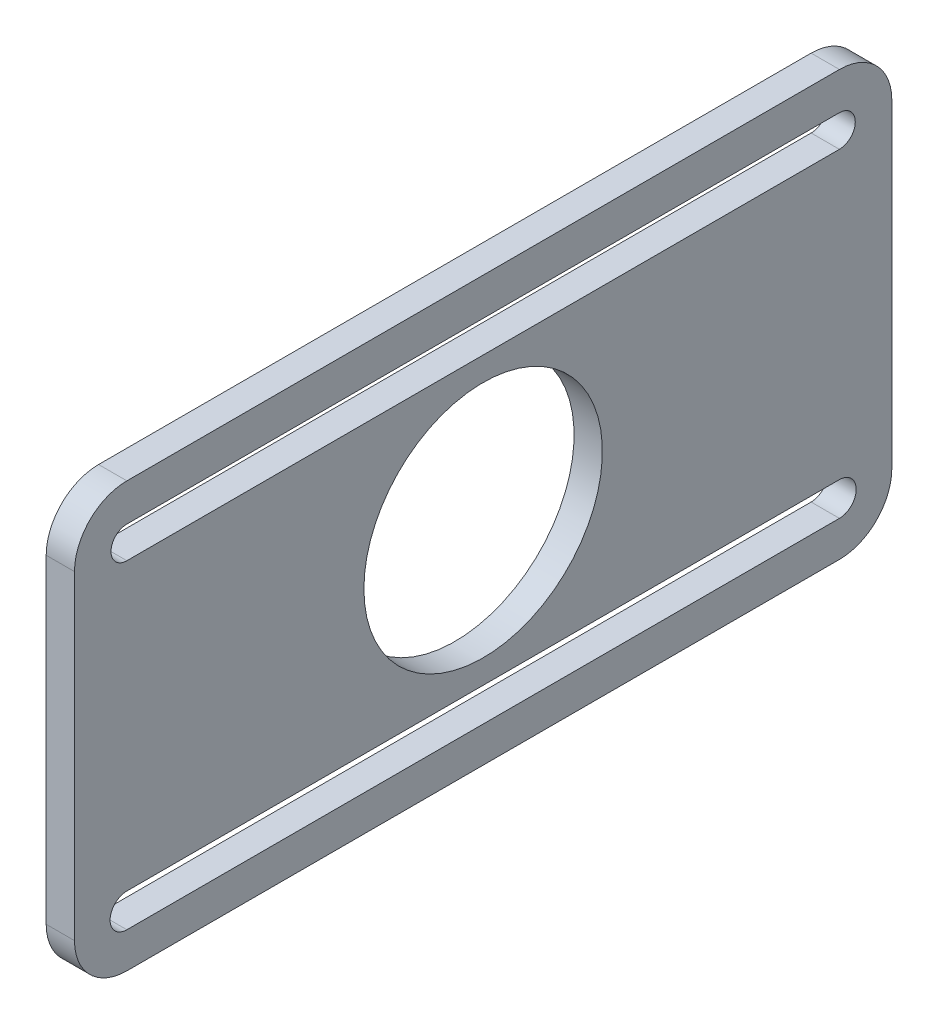
ISO-10303-21;
HEADER;
FILE_DESCRIPTION(('STEP AP214'),'2;1');
FILE_NAME('part.step','',(''),(''),'','','');
FILE_SCHEMA(('AUTOMOTIVE_DESIGN { 1 0 10303 214 1 1 1 1 }'));
ENDSEC;
DATA;
#1=APPLICATION_CONTEXT('core data for automotive mechanical design processes');
#2=APPLICATION_PROTOCOL_DEFINITION('international standard','automotive_design',2000,#1);
#3=PRODUCT_CONTEXT('',#1,'mechanical');
#4=PRODUCT('Part','Part','',(#3));
#5=PRODUCT_RELATED_PRODUCT_CATEGORY('part','',(#4));
#6=PRODUCT_DEFINITION_FORMATION('','',#4);
#7=PRODUCT_DEFINITION_CONTEXT('part definition',#1,'design');
#8=PRODUCT_DEFINITION('design','',#6,#7);
#9=PRODUCT_DEFINITION_SHAPE('','',#8);
#10=(LENGTH_UNIT() NAMED_UNIT(*) SI_UNIT(.MILLI.,.METRE.));
#11=(NAMED_UNIT(*) PLANE_ANGLE_UNIT() SI_UNIT($,.RADIAN.));
#12=(NAMED_UNIT(*) SI_UNIT($,.STERADIAN.) SOLID_ANGLE_UNIT());
#13=UNCERTAINTY_MEASURE_WITH_UNIT(LENGTH_MEASURE(1.E-05),#10,'distance_accuracy_value','');
#14=(GEOMETRIC_REPRESENTATION_CONTEXT(3) GLOBAL_UNCERTAINTY_ASSIGNED_CONTEXT((#13)) GLOBAL_UNIT_ASSIGNED_CONTEXT((#10,
#11,#12)) REPRESENTATION_CONTEXT('',''));
#15=CARTESIAN_POINT('',(0.,0.,0.));
#16=DIRECTION('',(0.,0.,1.));
#17=DIRECTION('',(1.,0.,0.));
#18=AXIS2_PLACEMENT_3D('',#15,#16,#17);
#19=CARTESIAN_POINT('',(2.7,-5.00509363152669,0.));
#20=DIRECTION('',(0.,-1.,0.));
#21=DIRECTION('',(0.,0.,-1.));
#22=AXIS2_PLACEMENT_3D('',#19,#20,#21);
#23=PLANE('',#22);
#24=DIRECTION('',(0.,0.,1.));
#25=VECTOR('',#24,1.);
#26=CARTESIAN_POINT('',(0.,-5.00509363152669,0.));
#27=LINE('',#26,#25);
#28=CARTESIAN_POINT('',(0.,-5.00509363152669,-34.));
#29=VERTEX_POINT('',#28);
#30=CARTESIAN_POINT('',(0.,-5.00509363152669,34.));
#31=VERTEX_POINT('',#30);
#32=EDGE_CURVE('E280',#29,#31,#27,.T.);
#33=ORIENTED_EDGE('',*,*,#32,.F.);
#34=DIRECTION('',(-1.,0.,0.));
#35=VECTOR('',#34,1.);
#36=CARTESIAN_POINT('',(2.7,-5.00509363152669,-34.));
#37=LINE('',#36,#35);
#38=CARTESIAN_POINT('',(2.7,-5.00509363152669,-34.));
#39=VERTEX_POINT('',#38);
#40=EDGE_CURVE('E11',#39,#29,#37,.T.);
#41=ORIENTED_EDGE('',*,*,#40,.F.);
#42=DIRECTION('',(0.,0.,1.));
#43=VECTOR('',#42,1.);
#44=CARTESIAN_POINT('',(2.7,-5.00509363152669,0.));
#45=LINE('',#44,#43);
#46=CARTESIAN_POINT('',(2.7,-5.00509363152669,34.));
#47=VERTEX_POINT('',#46);
#48=EDGE_CURVE('E343',#39,#47,#45,.T.);
#49=ORIENTED_EDGE('',*,*,#48,.T.);
#50=DIRECTION('',(-1.,0.,0.));
#51=VECTOR('',#50,1.);
#52=CARTESIAN_POINT('',(2.7,-5.00509363152669,34.));
#53=LINE('',#52,#51);
#54=EDGE_CURVE('E67',#47,#31,#53,.T.);
#55=ORIENTED_EDGE('',*,*,#54,.T.);
#56=EDGE_LOOP('',(#33,#41,#49,#55));
#57=FACE_BOUND('',#56,.T.);
#58=ADVANCED_FACE('F47',(#57),#23,.T.);
#59=CARTESIAN_POINT('',(2.7,-0.00509363152669193,-34.));
#60=DIRECTION('',(-1.,0.,0.));
#61=DIRECTION('',(0.,0.,1.));
#62=AXIS2_PLACEMENT_3D('',#59,#60,#61);
#63=CYLINDRICAL_SURFACE('',#62,5.);
#64=CARTESIAN_POINT('',(0.,-0.00509363152669193,-34.));
#65=DIRECTION('',(1.,0.,0.));
#66=DIRECTION('',(0.,0.,-1.));
#67=AXIS2_PLACEMENT_3D('',#64,#65,#66);
#68=CIRCLE('',#67,5.);
#69=CARTESIAN_POINT('',(0.,-0.00509363152669254,-39.));
#70=VERTEX_POINT('',#69);
#71=EDGE_CURVE('E283',#29,#70,#68,.T.);
#72=ORIENTED_EDGE('',*,*,#71,.T.);
#73=DIRECTION('',(-1.,0.,0.));
#74=VECTOR('',#73,1.);
#75=CARTESIAN_POINT('',(2.7,-0.00509363152669254,-39.));
#76=LINE('',#75,#74);
#77=CARTESIAN_POINT('',(2.7,-0.00509363152669254,-39.));
#78=VERTEX_POINT('',#77);
#79=EDGE_CURVE('E58',#78,#70,#76,.T.);
#80=ORIENTED_EDGE('',*,*,#79,.F.);
#81=CARTESIAN_POINT('',(2.7,-0.00509363152669193,-34.));
#82=DIRECTION('',(1.,0.,0.));
#83=DIRECTION('',(0.,0.,-1.));
#84=AXIS2_PLACEMENT_3D('',#81,#82,#83);
#85=CIRCLE('',#84,5.);
#86=EDGE_CURVE('E346',#39,#78,#85,.T.);
#87=ORIENTED_EDGE('',*,*,#86,.F.);
#88=ORIENTED_EDGE('',*,*,#40,.T.);
#89=EDGE_LOOP('',(#72,#80,#87,#88));
#90=FACE_BOUND('',#89,.T.);
#91=ADVANCED_FACE('F365',(#90),#63,.T.);
#92=CARTESIAN_POINT('',(2.7,0.,-39.));
#93=DIRECTION('',(0.,0.,-1.));
#94=DIRECTION('',(0.,1.,0.));
#95=AXIS2_PLACEMENT_3D('',#92,#93,#94);
#96=PLANE('',#95);
#97=DIRECTION('',(0.,-1.,0.));
#98=VECTOR('',#97,1.);
#99=CARTESIAN_POINT('',(0.,0.,-39.));
#100=LINE('',#99,#98);
#101=CARTESIAN_POINT('',(0.,30.4949063684733,-39.));
#102=VERTEX_POINT('',#101);
#103=EDGE_CURVE('E287',#102,#70,#100,.T.);
#104=ORIENTED_EDGE('',*,*,#103,.F.);
#105=DIRECTION('',(-1.,0.,0.));
#106=VECTOR('',#105,1.);
#107=CARTESIAN_POINT('',(2.7,30.4949063684733,-39.));
#108=LINE('',#107,#106);
#109=CARTESIAN_POINT('',(2.7,30.4949063684733,-39.));
#110=VERTEX_POINT('',#109);
#111=EDGE_CURVE('E206',#110,#102,#108,.T.);
#112=ORIENTED_EDGE('',*,*,#111,.F.);
#113=DIRECTION('',(0.,-1.,0.));
#114=VECTOR('',#113,1.);
#115=CARTESIAN_POINT('',(2.7,0.,-39.));
#116=LINE('',#115,#114);
#117=EDGE_CURVE('E349',#110,#78,#116,.T.);
#118=ORIENTED_EDGE('',*,*,#117,.T.);
#119=ORIENTED_EDGE('',*,*,#79,.T.);
#120=EDGE_LOOP('',(#104,#112,#118,#119));
#121=FACE_BOUND('',#120,.T.);
#122=ADVANCED_FACE('F368',(#121),#96,.T.);
#123=CARTESIAN_POINT('',(2.7,30.4949063684733,-34.));
#124=DIRECTION('',(-1.,0.,0.));
#125=DIRECTION('',(0.,0.,1.));
#126=AXIS2_PLACEMENT_3D('',#123,#124,#125);
#127=CYLINDRICAL_SURFACE('',#126,5.);
#128=CARTESIAN_POINT('',(0.,30.4949063684733,-34.));
#129=DIRECTION('',(1.,0.,0.));
#130=DIRECTION('',(0.,0.,-1.));
#131=AXIS2_PLACEMENT_3D('',#128,#129,#130);
#132=CIRCLE('',#131,5.);
#133=CARTESIAN_POINT('',(0.,35.4949063684733,-34.));
#134=VERTEX_POINT('',#133);
#135=EDGE_CURVE('E291',#134,#102,#132,.F.);
#136=ORIENTED_EDGE('',*,*,#135,.F.);
#137=DIRECTION('',(-1.,0.,0.));
#138=VECTOR('',#137,1.);
#139=CARTESIAN_POINT('',(2.7,35.4949063684733,-34.));
#140=LINE('',#139,#138);
#141=CARTESIAN_POINT('',(2.7,35.4949063684733,-34.));
#142=VERTEX_POINT('',#141);
#143=EDGE_CURVE('E199',#142,#134,#140,.T.);
#144=ORIENTED_EDGE('',*,*,#143,.F.);
#145=CARTESIAN_POINT('',(2.7,30.4949063684733,-34.));
#146=DIRECTION('',(1.,0.,0.));
#147=DIRECTION('',(0.,0.,-1.));
#148=AXIS2_PLACEMENT_3D('',#145,#146,#147);
#149=CIRCLE('',#148,5.);
#150=EDGE_CURVE('E353',#142,#110,#149,.F.);
#151=ORIENTED_EDGE('',*,*,#150,.T.);
#152=ORIENTED_EDGE('',*,*,#111,.T.);
#153=EDGE_LOOP('',(#136,#144,#151,#152));
#154=FACE_BOUND('',#153,.T.);
#155=ADVANCED_FACE('F371',(#154),#127,.T.);
#156=CARTESIAN_POINT('',(2.7,35.4949063684733,0.));
#157=DIRECTION('',(0.,-1.,0.));
#158=DIRECTION('',(0.,0.,-1.));
#159=AXIS2_PLACEMENT_3D('',#156,#157,#158);
#160=PLANE('',#159);
#161=DIRECTION('',(0.,0.,1.));
#162=VECTOR('',#161,1.);
#163=CARTESIAN_POINT('',(0.,35.4949063684733,0.));
#164=LINE('',#163,#162);
#165=CARTESIAN_POINT('',(0.,35.4949063684733,34.));
#166=VERTEX_POINT('',#165);
#167=EDGE_CURVE('E295',#134,#166,#164,.T.);
#168=ORIENTED_EDGE('',*,*,#167,.T.);
#169=DIRECTION('',(-1.,0.,0.));
#170=VECTOR('',#169,1.);
#171=CARTESIAN_POINT('',(2.7,35.4949063684733,34.));
#172=LINE('',#171,#170);
#173=CARTESIAN_POINT('',(2.7,35.4949063684733,34.));
#174=VERTEX_POINT('',#173);
#175=EDGE_CURVE('E195',#174,#166,#172,.T.);
#176=ORIENTED_EDGE('',*,*,#175,.F.);
#177=DIRECTION('',(0.,0.,1.));
#178=VECTOR('',#177,1.);
#179=CARTESIAN_POINT('',(2.7,35.4949063684733,0.));
#180=LINE('',#179,#178);
#181=EDGE_CURVE('E186',#142,#174,#180,.T.);
#182=ORIENTED_EDGE('',*,*,#181,.F.);
#183=ORIENTED_EDGE('',*,*,#143,.T.);
#184=EDGE_LOOP('',(#168,#176,#182,#183));
#185=FACE_BOUND('',#184,.T.);
#186=ADVANCED_FACE('F374',(#185),#160,.F.);
#187=CARTESIAN_POINT('',(2.7,30.4949063684733,34.));
#188=DIRECTION('',(-1.,0.,0.));
#189=DIRECTION('',(0.,0.,1.));
#190=AXIS2_PLACEMENT_3D('',#187,#188,#189);
#191=CYLINDRICAL_SURFACE('',#190,5.);
#192=CARTESIAN_POINT('',(0.,30.4949063684733,34.));
#193=DIRECTION('',(1.,0.,0.));
#194=DIRECTION('',(0.,0.,-1.));
#195=AXIS2_PLACEMENT_3D('',#192,#193,#194);
#196=CIRCLE('',#195,5.);
#197=CARTESIAN_POINT('',(0.,30.4949063684733,39.));
#198=VERTEX_POINT('',#197);
#199=EDGE_CURVE('E193',#166,#198,#196,.T.);
#200=ORIENTED_EDGE('',*,*,#199,.T.);
#201=DIRECTION('',(-1.,0.,0.));
#202=VECTOR('',#201,1.);
#203=CARTESIAN_POINT('',(2.7,30.4949063684733,39.));
#204=LINE('',#203,#202);
#205=CARTESIAN_POINT('',(2.7,30.4949063684733,39.));
#206=VERTEX_POINT('',#205);
#207=EDGE_CURVE('E173',#206,#198,#204,.T.);
#208=ORIENTED_EDGE('',*,*,#207,.F.);
#209=CARTESIAN_POINT('',(2.7,30.4949063684733,34.));
#210=DIRECTION('',(1.,0.,0.));
#211=DIRECTION('',(0.,0.,-1.));
#212=AXIS2_PLACEMENT_3D('',#209,#210,#211);
#213=CIRCLE('',#212,5.);
#214=EDGE_CURVE('E179',#174,#206,#213,.T.);
#215=ORIENTED_EDGE('',*,*,#214,.F.);
#216=ORIENTED_EDGE('',*,*,#175,.T.);
#217=EDGE_LOOP('',(#200,#208,#215,#216));
#218=FACE_BOUND('',#217,.T.);
#219=ADVANCED_FACE('F192',(#218),#191,.T.);
#220=CARTESIAN_POINT('',(2.7,0.,39.));
#221=DIRECTION('',(0.,0.,-1.));
#222=DIRECTION('',(0.,1.,0.));
#223=AXIS2_PLACEMENT_3D('',#220,#221,#222);
#224=PLANE('',#223);
#225=DIRECTION('',(0.,-1.,0.));
#226=VECTOR('',#225,1.);
#227=CARTESIAN_POINT('',(0.,0.,39.));
#228=LINE('',#227,#226);
#229=CARTESIAN_POINT('',(0.,-0.00509363152669254,39.));
#230=VERTEX_POINT('',#229);
#231=EDGE_CURVE('E301',#198,#230,#228,.T.);
#232=ORIENTED_EDGE('',*,*,#231,.T.);
#233=DIRECTION('',(-1.,0.,0.));
#234=VECTOR('',#233,1.);
#235=CARTESIAN_POINT('',(2.7,-0.00509363152669254,39.));
#236=LINE('',#235,#234);
#237=CARTESIAN_POINT('',(2.7,-0.00509363152669254,39.));
#238=VERTEX_POINT('',#237);
#239=EDGE_CURVE('E117',#238,#230,#236,.T.);
#240=ORIENTED_EDGE('',*,*,#239,.F.);
#241=DIRECTION('',(0.,-1.,0.));
#242=VECTOR('',#241,1.);
#243=CARTESIAN_POINT('',(2.7,0.,39.));
#244=LINE('',#243,#242);
#245=EDGE_CURVE('E169',#206,#238,#244,.T.);
#246=ORIENTED_EDGE('',*,*,#245,.F.);
#247=ORIENTED_EDGE('',*,*,#207,.T.);
#248=EDGE_LOOP('',(#232,#240,#246,#247));
#249=FACE_BOUND('',#248,.T.);
#250=ADVANCED_FACE('F171',(#249),#224,.F.);
#251=CARTESIAN_POINT('',(2.7,31.9222769607914,0.));
#252=DIRECTION('',(0.,1.,0.));
#253=DIRECTION('',(0.,0.,1.));
#254=AXIS2_PLACEMENT_3D('',#251,#252,#253);
#255=PLANE('',#254);
#256=DIRECTION('',(0.,0.,-1.));
#257=VECTOR('',#256,1.);
#258=CARTESIAN_POINT('',(0.,31.9222769607914,0.));
#259=LINE('',#258,#257);
#260=CARTESIAN_POINT('',(0.,31.9222769607914,34.));
#261=VERTEX_POINT('',#260);
#262=CARTESIAN_POINT('',(0.,31.9222769607914,-34.));
#263=VERTEX_POINT('',#262);
#264=EDGE_CURVE('E260',#261,#263,#259,.T.);
#265=ORIENTED_EDGE('',*,*,#264,.T.);
#266=DIRECTION('',(-1.,0.,0.));
#267=VECTOR('',#266,1.);
#268=CARTESIAN_POINT('',(2.7,31.9222769607914,-34.));
#269=LINE('',#268,#267);
#270=CARTESIAN_POINT('',(2.7,31.9222769607914,-34.));
#271=VERTEX_POINT('',#270);
#272=EDGE_CURVE('E220',#271,#263,#269,.T.);
#273=ORIENTED_EDGE('',*,*,#272,.F.);
#274=DIRECTION('',(0.,0.,-1.));
#275=VECTOR('',#274,1.);
#276=CARTESIAN_POINT('',(2.7,31.9222769607914,0.));
#277=LINE('',#276,#275);
#278=CARTESIAN_POINT('',(2.7,31.9222769607914,34.));
#279=VERTEX_POINT('',#278);
#280=EDGE_CURVE('E324',#279,#271,#277,.T.);
#281=ORIENTED_EDGE('',*,*,#280,.F.);
#282=DIRECTION('',(-1.,0.,0.));
#283=VECTOR('',#282,1.);
#284=CARTESIAN_POINT('',(2.7,31.9222769607914,34.));
#285=LINE('',#284,#283);
#286=EDGE_CURVE('E211',#279,#261,#285,.T.);
#287=ORIENTED_EDGE('',*,*,#286,.T.);
#288=EDGE_LOOP('',(#265,#273,#281,#287));
#289=FACE_BOUND('',#288,.T.);
#290=ADVANCED_FACE('F409',(#289),#255,.F.);
#291=CARTESIAN_POINT('',(2.7,30.4085916646324,-34.));
#292=DIRECTION('',(-1.,0.,0.));
#293=DIRECTION('',(0.,0.,1.));
#294=AXIS2_PLACEMENT_3D('',#291,#292,#293);
#295=CYLINDRICAL_SURFACE('',#294,1.51368529615904);
#296=CARTESIAN_POINT('',(0.,30.4085916646324,-34.));
#297=DIRECTION('',(1.,0.,0.));
#298=DIRECTION('',(0.,0.,-1.));
#299=AXIS2_PLACEMENT_3D('',#296,#297,#298);
#300=CIRCLE('',#299,1.51368529615904);
#301=CARTESIAN_POINT('',(0.,28.8949063684733,-34.));
#302=VERTEX_POINT('',#301);
#303=EDGE_CURVE('E264',#263,#302,#300,.F.);
#304=ORIENTED_EDGE('',*,*,#303,.T.);
#305=DIRECTION('',(-1.,0.,0.));
#306=VECTOR('',#305,1.);
#307=CARTESIAN_POINT('',(2.7,28.8949063684733,-34.));
#308=LINE('',#307,#306);
#309=CARTESIAN_POINT('',(2.7,28.8949063684733,-34.));
#310=VERTEX_POINT('',#309);
#311=EDGE_CURVE('E217',#310,#302,#308,.T.);
#312=ORIENTED_EDGE('',*,*,#311,.F.);
#313=CARTESIAN_POINT('',(2.7,30.4085916646324,-34.));
#314=DIRECTION('',(1.,0.,0.));
#315=DIRECTION('',(0.,0.,-1.));
#316=AXIS2_PLACEMENT_3D('',#313,#314,#315);
#317=CIRCLE('',#316,1.51368529615904);
#318=EDGE_CURVE('E328',#271,#310,#317,.F.);
#319=ORIENTED_EDGE('',*,*,#318,.F.);
#320=ORIENTED_EDGE('',*,*,#272,.T.);
#321=EDGE_LOOP('',(#304,#312,#319,#320));
#322=FACE_BOUND('',#321,.T.);
#323=ADVANCED_FACE('F405',(#322),#295,.F.);
#324=CARTESIAN_POINT('',(2.7,28.8949063684733,0.));
#325=DIRECTION('',(0.,1.,0.));
#326=DIRECTION('',(0.,0.,1.));
#327=AXIS2_PLACEMENT_3D('',#324,#325,#326);
#328=PLANE('',#327);
#329=DIRECTION('',(0.,0.,-1.));
#330=VECTOR('',#329,1.);
#331=CARTESIAN_POINT('',(0.,28.8949063684733,0.));
#332=LINE('',#331,#330);
#333=CARTESIAN_POINT('',(0.,28.8949063684733,34.));
#334=VERTEX_POINT('',#333);
#335=EDGE_CURVE('E268',#334,#302,#332,.T.);
#336=ORIENTED_EDGE('',*,*,#335,.F.);
#337=DIRECTION('',(-1.,0.,0.));
#338=VECTOR('',#337,1.);
#339=CARTESIAN_POINT('',(2.7,28.8949063684733,34.));
#340=LINE('',#339,#338);
#341=CARTESIAN_POINT('',(2.7,28.8949063684733,34.));
#342=VERTEX_POINT('',#341);
#343=EDGE_CURVE('E214',#342,#334,#340,.T.);
#344=ORIENTED_EDGE('',*,*,#343,.F.);
#345=DIRECTION('',(0.,0.,-1.));
#346=VECTOR('',#345,1.);
#347=CARTESIAN_POINT('',(2.7,28.8949063684733,0.));
#348=LINE('',#347,#346);
#349=EDGE_CURVE('E331',#342,#310,#348,.T.);
#350=ORIENTED_EDGE('',*,*,#349,.T.);
#351=ORIENTED_EDGE('',*,*,#311,.T.);
#352=EDGE_LOOP('',(#336,#344,#350,#351));
#353=FACE_BOUND('',#352,.T.);
#354=ADVANCED_FACE('F402',(#353),#328,.T.);
#355=CARTESIAN_POINT('',(2.7,1.59490636847331,0.));
#356=DIRECTION('',(0.,1.,0.));
#357=DIRECTION('',(0.,0.,1.));
#358=AXIS2_PLACEMENT_3D('',#355,#356,#357);
#359=PLANE('',#358);
#360=DIRECTION('',(0.,0.,-1.));
#361=VECTOR('',#360,1.);
#362=CARTESIAN_POINT('',(0.,1.59490636847331,0.));
#363=LINE('',#362,#361);
#364=CARTESIAN_POINT('',(0.,1.59490636847331,34.));
#365=VERTEX_POINT('',#364);
#366=CARTESIAN_POINT('',(0.,1.59490636847331,-34.));
#367=VERTEX_POINT('',#366);
#368=EDGE_CURVE('E244',#365,#367,#363,.T.);
#369=ORIENTED_EDGE('',*,*,#368,.T.);
#370=DIRECTION('',(-1.,0.,0.));
#371=VECTOR('',#370,1.);
#372=CARTESIAN_POINT('',(2.7,1.59490636847331,-34.));
#373=LINE('',#372,#371);
#374=CARTESIAN_POINT('',(2.7,1.59490636847331,-34.));
#375=VERTEX_POINT('',#374);
#376=EDGE_CURVE('E51',#375,#367,#373,.T.);
#377=ORIENTED_EDGE('',*,*,#376,.F.);
#378=DIRECTION('',(0.,0.,-1.));
#379=VECTOR('',#378,1.);
#380=CARTESIAN_POINT('',(2.7,1.59490636847331,0.));
#381=LINE('',#380,#379);
#382=CARTESIAN_POINT('',(2.7,1.59490636847331,34.));
#383=VERTEX_POINT('',#382);
#384=EDGE_CURVE('E307',#383,#375,#381,.T.);
#385=ORIENTED_EDGE('',*,*,#384,.F.);
#386=DIRECTION('',(-1.,0.,0.));
#387=VECTOR('',#386,1.);
#388=CARTESIAN_POINT('',(2.7,1.59490636847331,34.));
#389=LINE('',#388,#387);
#390=EDGE_CURVE('E224',#383,#365,#389,.T.);
#391=ORIENTED_EDGE('',*,*,#390,.T.);
#392=EDGE_LOOP('',(#369,#377,#385,#391));
#393=FACE_BOUND('',#392,.T.);
#394=ADVANCED_FACE('F49',(#393),#359,.F.);
#395=CARTESIAN_POINT('',(2.7,-0.00509363152669407,-34.));
#396=DIRECTION('',(-1.,0.,0.));
#397=DIRECTION('',(0.,0.,1.));
#398=AXIS2_PLACEMENT_3D('',#395,#396,#397);
#399=CYLINDRICAL_SURFACE('',#398,1.6);
#400=CARTESIAN_POINT('',(0.,-0.00509363152669407,-34.));
#401=DIRECTION('',(1.,0.,0.));
#402=DIRECTION('',(0.,0.,-1.));
#403=AXIS2_PLACEMENT_3D('',#400,#401,#402);
#404=CIRCLE('',#403,1.6);
#405=CARTESIAN_POINT('',(0.,-1.60509363152669,-34.));
#406=VERTEX_POINT('',#405);
#407=EDGE_CURVE('E239',#367,#406,#404,.F.);
#408=ORIENTED_EDGE('',*,*,#407,.T.);
#409=DIRECTION('',(-1.,0.,0.));
#410=VECTOR('',#409,1.);
#411=CARTESIAN_POINT('',(2.7,-1.60509363152669,-34.));
#412=LINE('',#411,#410);
#413=CARTESIAN_POINT('',(2.7,-1.60509363152669,-34.));
#414=VERTEX_POINT('',#413);
#415=EDGE_CURVE('E229',#414,#406,#412,.T.);
#416=ORIENTED_EDGE('',*,*,#415,.F.);
#417=CARTESIAN_POINT('',(2.7,-0.00509363152669407,-34.));
#418=DIRECTION('',(1.,0.,0.));
#419=DIRECTION('',(0.,0.,-1.));
#420=AXIS2_PLACEMENT_3D('',#417,#418,#419);
#421=CIRCLE('',#420,1.6);
#422=EDGE_CURVE('E130',#375,#414,#421,.F.);
#423=ORIENTED_EDGE('',*,*,#422,.F.);
#424=ORIENTED_EDGE('',*,*,#376,.T.);
#425=EDGE_LOOP('',(#408,#416,#423,#424));
#426=FACE_BOUND('',#425,.T.);
#427=ADVANCED_FACE('F238',(#426),#399,.F.);
#428=CARTESIAN_POINT('',(2.7,-1.60509363152669,0.));
#429=DIRECTION('',(0.,1.,0.));
#430=DIRECTION('',(0.,0.,1.));
#431=AXIS2_PLACEMENT_3D('',#428,#429,#430);
#432=PLANE('',#431);
#433=DIRECTION('',(0.,0.,-1.));
#434=VECTOR('',#433,1.);
#435=CARTESIAN_POINT('',(0.,-1.60509363152669,0.));
#436=LINE('',#435,#434);
#437=CARTESIAN_POINT('',(0.,-1.60509363152669,34.));
#438=VERTEX_POINT('',#437);
#439=EDGE_CURVE('E251',#438,#406,#436,.T.);
#440=ORIENTED_EDGE('',*,*,#439,.F.);
#441=DIRECTION('',(-1.,0.,0.));
#442=VECTOR('',#441,1.);
#443=CARTESIAN_POINT('',(2.7,-1.60509363152669,34.));
#444=LINE('',#443,#442);
#445=CARTESIAN_POINT('',(2.7,-1.60509363152669,34.));
#446=VERTEX_POINT('',#445);
#447=EDGE_CURVE('E227',#446,#438,#444,.T.);
#448=ORIENTED_EDGE('',*,*,#447,.F.);
#449=DIRECTION('',(0.,0.,-1.));
#450=VECTOR('',#449,1.);
#451=CARTESIAN_POINT('',(2.7,-1.60509363152669,0.));
#452=LINE('',#451,#450);
#453=EDGE_CURVE('E315',#446,#414,#452,.T.);
#454=ORIENTED_EDGE('',*,*,#453,.T.);
#455=ORIENTED_EDGE('',*,*,#415,.T.);
#456=EDGE_LOOP('',(#440,#448,#454,#455));
#457=FACE_BOUND('',#456,.T.);
#458=ADVANCED_FACE('F396',(#457),#432,.T.);
#459=CARTESIAN_POINT('',(2.7,15.2449063684733,0.));
#460=DIRECTION('',(-1.,0.,0.));
#461=DIRECTION('',(0.,0.,1.));
#462=AXIS2_PLACEMENT_3D('',#459,#460,#461);
#463=CYLINDRICAL_SURFACE('',#462,11.3804872327745);
#464=CARTESIAN_POINT('',(2.7,15.2449063684733,0.));
#465=DIRECTION('',(1.,0.,0.));
#466=DIRECTION('',(0.,0.,-1.));
#467=AXIS2_PLACEMENT_3D('',#464,#465,#466);
#468=CIRCLE('',#467,11.3804872327745);
#469=CARTESIAN_POINT('',(2.7,15.2449063684733,11.3804872327745));
#470=VERTEX_POINT('',#469);
#471=EDGE_CURVE('E339',#470,#470,#468,.T.);
#472=CARTESIAN_POINT('',(0.,15.2449063684733,0.));
#473=DIRECTION('',(1.,0.,0.));
#474=DIRECTION('',(0.,0.,-1.));
#475=AXIS2_PLACEMENT_3D('',#472,#473,#474);
#476=CIRCLE('',#475,11.3804872327745);
#477=CARTESIAN_POINT('',(0.,15.2449063684733,11.3804872327745));
#478=VERTEX_POINT('',#477);
#479=EDGE_CURVE('E276',#478,#478,#476,.T.);
#480=CARTESIAN_POINT('',(2.7,15.2449063684733,11.3804872327745));
#481=CARTESIAN_POINT('',(2.671875,15.2449063684733,11.3804872327745));
#482=CARTESIAN_POINT('',(2.64375,15.2449063684733,11.3804872327745));
#483=CARTESIAN_POINT('',(2.5875,15.2449063684733,11.3804872327745));
#484=CARTESIAN_POINT('',(2.559375,15.2449063684733,11.3804872327745));
#485=CARTESIAN_POINT('',(2.503125,15.2449063684733,11.3804872327745));
#486=CARTESIAN_POINT('',(2.475,15.2449063684733,11.3804872327745));
#487=CARTESIAN_POINT('',(2.41875,15.2449063684733,11.3804872327745));
#488=CARTESIAN_POINT('',(2.390625,15.2449063684733,11.3804872327745));
#489=CARTESIAN_POINT('',(2.334375,15.2449063684733,11.3804872327745));
#490=CARTESIAN_POINT('',(2.30625,15.2449063684733,11.3804872327745));
#491=CARTESIAN_POINT('',(2.25,15.2449063684733,11.3804872327745));
#492=CARTESIAN_POINT('',(2.221875,15.2449063684733,11.3804872327745));
#493=CARTESIAN_POINT('',(2.165625,15.2449063684733,11.3804872327745));
#494=CARTESIAN_POINT('',(2.1375,15.2449063684733,11.3804872327745));
#495=CARTESIAN_POINT('',(2.08125,15.2449063684733,11.3804872327745));
#496=CARTESIAN_POINT('',(2.053125,15.2449063684733,11.3804872327745));
#497=CARTESIAN_POINT('',(1.996875,15.2449063684733,11.3804872327745));
#498=CARTESIAN_POINT('',(1.96875,15.2449063684733,11.3804872327745));
#499=CARTESIAN_POINT('',(1.9125,15.2449063684733,11.3804872327745));
#500=CARTESIAN_POINT('',(1.884375,15.2449063684733,11.3804872327745));
#501=CARTESIAN_POINT('',(1.828125,15.2449063684733,11.3804872327745));
#502=CARTESIAN_POINT('',(1.8,15.2449063684733,11.3804872327745));
#503=CARTESIAN_POINT('',(1.74375,15.2449063684733,11.3804872327745));
#504=CARTESIAN_POINT('',(1.715625,15.2449063684733,11.3804872327745));
#505=CARTESIAN_POINT('',(1.659375,15.2449063684733,11.3804872327745));
#506=CARTESIAN_POINT('',(1.63125,15.2449063684733,11.3804872327745));
#507=CARTESIAN_POINT('',(1.575,15.2449063684733,11.3804872327745));
#508=CARTESIAN_POINT('',(1.546875,15.2449063684733,11.3804872327745));
#509=CARTESIAN_POINT('',(1.490625,15.2449063684733,11.3804872327745));
#510=CARTESIAN_POINT('',(1.4625,15.2449063684733,11.3804872327745));
#511=CARTESIAN_POINT('',(1.40625,15.2449063684733,11.3804872327745));
#512=CARTESIAN_POINT('',(1.378125,15.2449063684733,11.3804872327745));
#513=CARTESIAN_POINT('',(1.321875,15.2449063684733,11.3804872327745));
#514=CARTESIAN_POINT('',(1.29375,15.2449063684733,11.3804872327745));
#515=CARTESIAN_POINT('',(1.2375,15.2449063684733,11.3804872327745));
#516=CARTESIAN_POINT('',(1.209375,15.2449063684733,11.3804872327745));
#517=CARTESIAN_POINT('',(1.153125,15.2449063684733,11.3804872327745));
#518=CARTESIAN_POINT('',(1.125,15.2449063684733,11.3804872327745));
#519=CARTESIAN_POINT('',(1.06875,15.2449063684733,11.3804872327745));
#520=CARTESIAN_POINT('',(1.040625,15.2449063684733,11.3804872327745));
#521=CARTESIAN_POINT('',(0.984375,15.2449063684733,11.3804872327745));
#522=CARTESIAN_POINT('',(0.95625,15.2449063684733,11.3804872327745));
#523=CARTESIAN_POINT('',(0.9,15.2449063684733,11.3804872327745));
#524=CARTESIAN_POINT('',(0.871875,15.2449063684733,11.3804872327745));
#525=CARTESIAN_POINT('',(0.815625,15.2449063684733,11.3804872327745));
#526=CARTESIAN_POINT('',(0.7875,15.2449063684733,11.3804872327745));
#527=CARTESIAN_POINT('',(0.73125,15.2449063684733,11.3804872327745));
#528=CARTESIAN_POINT('',(0.703125,15.2449063684733,11.3804872327745));
#529=CARTESIAN_POINT('',(0.646875,15.2449063684733,11.3804872327745));
#530=CARTESIAN_POINT('',(0.61875,15.2449063684733,11.3804872327745));
#531=CARTESIAN_POINT('',(0.5625,15.2449063684733,11.3804872327745));
#532=CARTESIAN_POINT('',(0.534375,15.2449063684733,11.3804872327745));
#533=CARTESIAN_POINT('',(0.478125,15.2449063684733,11.3804872327745));
#534=CARTESIAN_POINT('',(0.45,15.2449063684733,11.3804872327745));
#535=CARTESIAN_POINT('',(0.39375,15.2449063684733,11.3804872327745));
#536=CARTESIAN_POINT('',(0.365625,15.2449063684733,11.3804872327745));
#537=CARTESIAN_POINT('',(0.309375,15.2449063684733,11.3804872327745));
#538=CARTESIAN_POINT('',(0.28125,15.2449063684733,11.3804872327745));
#539=CARTESIAN_POINT('',(0.225,15.2449063684733,11.3804872327745));
#540=CARTESIAN_POINT('',(0.196875,15.2449063684733,11.3804872327745));
#541=CARTESIAN_POINT('',(0.140625,15.2449063684733,11.3804872327745));
#542=CARTESIAN_POINT('',(0.112499999999999,15.2449063684733,11.3804872327745));
#543=CARTESIAN_POINT('',(0.0562499999999994,15.2449063684733,11.3804872327745));
#544=CARTESIAN_POINT('',(0.0281249999999995,15.2449063684733,11.3804872327745));
#545=CARTESIAN_POINT('',(0.,15.2449063684733,11.3804872327745));
#546=B_SPLINE_CURVE_WITH_KNOTS('',3,(#480,#481,#482,#483,#484,#485,#486,#487,#488,#489,#490,
#491,#492,#493,#494,#495,#496,#497,#498,#499,#500,#501,#502,#503,#504,#505,#506,#507,#508,#509,
#510,#511,#512,#513,#514,#515,#516,#517,#518,#519,#520,#521,#522,#523,#524,#525,#526,#527,#528,
#529,#530,#531,#532,#533,#534,#535,#536,#537,#538,#539,#540,#541,#542,#543,#544,#545),
.UNSPECIFIED.,.F.,.F.,(4,2,2,2,2,2,2,2,2,2,2,2,2,2,2,2,2,2,2,2,2,2,2,2,2,2,2,2,2,2,2,2,4),(0.,
0.0843749999999998,0.16875,0.253125,0.3375,0.421875,0.50625,0.590625,0.675,0.759375,0.84375,
0.928125,1.0125,1.096875,1.18125,1.265625,1.35,1.434375,1.51875,1.603125,1.6875,1.771875,
1.85625,1.940625,2.025,2.109375,2.19375,2.278125,2.3625,2.446875,2.53125,2.615625,2.7),.UNSPECIFIED.);
#547=EDGE_CURVE('BSEAM392',#470,#478,#546,.T.);
#548=ORIENTED_EDGE('',*,*,#471,.T.);
#549=ORIENTED_EDGE('',*,*,#479,.F.);
#550=ORIENTED_EDGE('',*,*,#547,.T.);
#551=ORIENTED_EDGE('',*,*,#547,.F.);
#552=EDGE_LOOP('',(#548,#550,#549,#551));
#553=FACE_BOUND('',#552,.T.);
#554=ADVANCED_FACE('F392',(#553),#463,.F.);
#555=CARTESIAN_POINT('',(2.7,30.4085916646324,34.));
#556=DIRECTION('',(-1.,0.,0.));
#557=DIRECTION('',(0.,0.,1.));
#558=AXIS2_PLACEMENT_3D('',#555,#556,#557);
#559=CYLINDRICAL_SURFACE('',#558,1.51368529615904);
#560=CARTESIAN_POINT('',(0.,30.4085916646324,34.));
#561=DIRECTION('',(1.,0.,0.));
#562=DIRECTION('',(0.,0.,-1.));
#563=AXIS2_PLACEMENT_3D('',#560,#561,#562);
#564=CIRCLE('',#563,1.51368529615904);
#565=EDGE_CURVE('E272',#261,#334,#564,.T.);
#566=ORIENTED_EDGE('',*,*,#565,.F.);
#567=ORIENTED_EDGE('',*,*,#286,.F.);
#568=CARTESIAN_POINT('',(2.7,30.4085916646324,34.));
#569=DIRECTION('',(1.,0.,0.));
#570=DIRECTION('',(0.,0.,-1.));
#571=AXIS2_PLACEMENT_3D('',#568,#569,#570);
#572=CIRCLE('',#571,1.51368529615904);
#573=EDGE_CURVE('E335',#279,#342,#572,.T.);
#574=ORIENTED_EDGE('',*,*,#573,.T.);
#575=ORIENTED_EDGE('',*,*,#343,.T.);
#576=EDGE_LOOP('',(#566,#567,#574,#575));
#577=FACE_BOUND('',#576,.T.);
#578=ADVANCED_FACE('F395',(#577),#559,.F.);
#579=CARTESIAN_POINT('',(2.7,-0.00509363152669407,34.));
#580=DIRECTION('',(-1.,0.,0.));
#581=DIRECTION('',(0.,0.,1.));
#582=AXIS2_PLACEMENT_3D('',#579,#580,#581);
#583=CYLINDRICAL_SURFACE('',#582,1.6);
#584=CARTESIAN_POINT('',(0.,-0.00509363152669407,34.));
#585=DIRECTION('',(1.,0.,0.));
#586=DIRECTION('',(0.,0.,-1.));
#587=AXIS2_PLACEMENT_3D('',#584,#585,#586);
#588=CIRCLE('',#587,1.6);
#589=EDGE_CURVE('E257',#365,#438,#588,.T.);
#590=ORIENTED_EDGE('',*,*,#589,.F.);
#591=ORIENTED_EDGE('',*,*,#390,.F.);
#592=CARTESIAN_POINT('',(2.7,-0.00509363152669407,34.));
#593=DIRECTION('',(1.,0.,0.));
#594=DIRECTION('',(0.,0.,-1.));
#595=AXIS2_PLACEMENT_3D('',#592,#593,#594);
#596=CIRCLE('',#595,1.6);
#597=EDGE_CURVE('E320',#383,#446,#596,.T.);
#598=ORIENTED_EDGE('',*,*,#597,.T.);
#599=ORIENTED_EDGE('',*,*,#447,.T.);
#600=EDGE_LOOP('',(#590,#591,#598,#599));
#601=FACE_BOUND('',#600,.T.);
#602=ADVANCED_FACE('F400',(#601),#583,.F.);
#603=CARTESIAN_POINT('',(2.7,-0.00509363152669193,34.));
#604=DIRECTION('',(-1.,0.,0.));
#605=DIRECTION('',(0.,0.,1.));
#606=AXIS2_PLACEMENT_3D('',#603,#604,#605);
#607=CYLINDRICAL_SURFACE('',#606,5.);
#608=CARTESIAN_POINT('',(0.,-0.00509363152669193,34.));
#609=DIRECTION('',(1.,0.,0.));
#610=DIRECTION('',(0.,0.,-1.));
#611=AXIS2_PLACEMENT_3D('',#608,#609,#610);
#612=CIRCLE('',#611,5.);
#613=EDGE_CURVE('E304',#31,#230,#612,.F.);
#614=ORIENTED_EDGE('',*,*,#613,.F.);
#615=ORIENTED_EDGE('',*,*,#54,.F.);
#616=CARTESIAN_POINT('',(2.7,-0.00509363152669193,34.));
#617=DIRECTION('',(1.,0.,0.));
#618=DIRECTION('',(0.,0.,-1.));
#619=AXIS2_PLACEMENT_3D('',#616,#617,#618);
#620=CIRCLE('',#619,5.);
#621=EDGE_CURVE('E178',#47,#238,#620,.F.);
#622=ORIENTED_EDGE('',*,*,#621,.T.);
#623=ORIENTED_EDGE('',*,*,#239,.T.);
#624=EDGE_LOOP('',(#614,#615,#622,#623));
#625=FACE_BOUND('',#624,.T.);
#626=ADVANCED_FACE('F359',(#625),#607,.T.);
#627=CARTESIAN_POINT('',(2.7,0.,0.));
#628=DIRECTION('',(1.,0.,0.));
#629=DIRECTION('',(0.,0.,-1.));
#630=AXIS2_PLACEMENT_3D('',#627,#628,#629);
#631=PLANE('',#630);
#632=ORIENTED_EDGE('',*,*,#384,.T.);
#633=ORIENTED_EDGE('',*,*,#422,.T.);
#634=ORIENTED_EDGE('',*,*,#453,.F.);
#635=ORIENTED_EDGE('',*,*,#597,.F.);
#636=EDGE_LOOP('',(#632,#633,#634,#635));
#637=FACE_BOUND('',#636,.T.);
#638=ORIENTED_EDGE('',*,*,#280,.T.);
#639=ORIENTED_EDGE('',*,*,#318,.T.);
#640=ORIENTED_EDGE('',*,*,#349,.F.);
#641=ORIENTED_EDGE('',*,*,#573,.F.);
#642=EDGE_LOOP('',(#638,#639,#640,#641));
#643=FACE_BOUND('',#642,.T.);
#644=ORIENTED_EDGE('',*,*,#471,.F.);
#645=EDGE_LOOP('',(#644));
#646=FACE_BOUND('',#645,.T.);
#647=ORIENTED_EDGE('',*,*,#48,.F.);
#648=ORIENTED_EDGE('',*,*,#86,.T.);
#649=ORIENTED_EDGE('',*,*,#117,.F.);
#650=ORIENTED_EDGE('',*,*,#150,.F.);
#651=ORIENTED_EDGE('',*,*,#181,.T.);
#652=ORIENTED_EDGE('',*,*,#214,.T.);
#653=ORIENTED_EDGE('',*,*,#245,.T.);
#654=ORIENTED_EDGE('',*,*,#621,.F.);
#655=EDGE_LOOP('',(#647,#648,#649,#650,#651,#652,#653,#654));
#656=FACE_BOUND('',#655,.T.);
#657=ADVANCED_FACE('F183',(#637,#643,#646,#656),#631,.T.);
#658=CARTESIAN_POINT('',(0.,0.,0.));
#659=DIRECTION('',(1.,0.,0.));
#660=DIRECTION('',(0.,0.,-1.));
#661=AXIS2_PLACEMENT_3D('',#658,#659,#660);
#662=PLANE('',#661);
#663=ORIENTED_EDGE('',*,*,#368,.F.);
#664=ORIENTED_EDGE('',*,*,#589,.T.);
#665=ORIENTED_EDGE('',*,*,#439,.T.);
#666=ORIENTED_EDGE('',*,*,#407,.F.);
#667=EDGE_LOOP('',(#663,#664,#665,#666));
#668=FACE_BOUND('',#667,.T.);
#669=ORIENTED_EDGE('',*,*,#264,.F.);
#670=ORIENTED_EDGE('',*,*,#565,.T.);
#671=ORIENTED_EDGE('',*,*,#335,.T.);
#672=ORIENTED_EDGE('',*,*,#303,.F.);
#673=EDGE_LOOP('',(#669,#670,#671,#672));
#674=FACE_BOUND('',#673,.T.);
#675=ORIENTED_EDGE('',*,*,#479,.T.);
#676=EDGE_LOOP('',(#675));
#677=FACE_BOUND('',#676,.T.);
#678=ORIENTED_EDGE('',*,*,#32,.T.);
#679=ORIENTED_EDGE('',*,*,#613,.T.);
#680=ORIENTED_EDGE('',*,*,#231,.F.);
#681=ORIENTED_EDGE('',*,*,#199,.F.);
#682=ORIENTED_EDGE('',*,*,#167,.F.);
#683=ORIENTED_EDGE('',*,*,#135,.T.);
#684=ORIENTED_EDGE('',*,*,#103,.T.);
#685=ORIENTED_EDGE('',*,*,#71,.F.);
#686=EDGE_LOOP('',(#678,#679,#680,#681,#682,#683,#684,#685));
#687=FACE_BOUND('',#686,.T.);
#688=ADVANCED_FACE('F375',(#668,#674,#677,#687),#662,.F.);
#689=CLOSED_SHELL('',(#58,#91,#122,#155,#186,#219,#250,#290,#323,#354,#394,#427,#458,#554,#578,
#602,#626,#657,#688));
#690=MANIFOLD_SOLID_BREP('B2',#689);
#691=ADVANCED_BREP_SHAPE_REPRESENTATION('',(#18,#690),#14);
#692=SHAPE_DEFINITION_REPRESENTATION(#9,#691);
ENDSEC;
END-ISO-10303-21;
